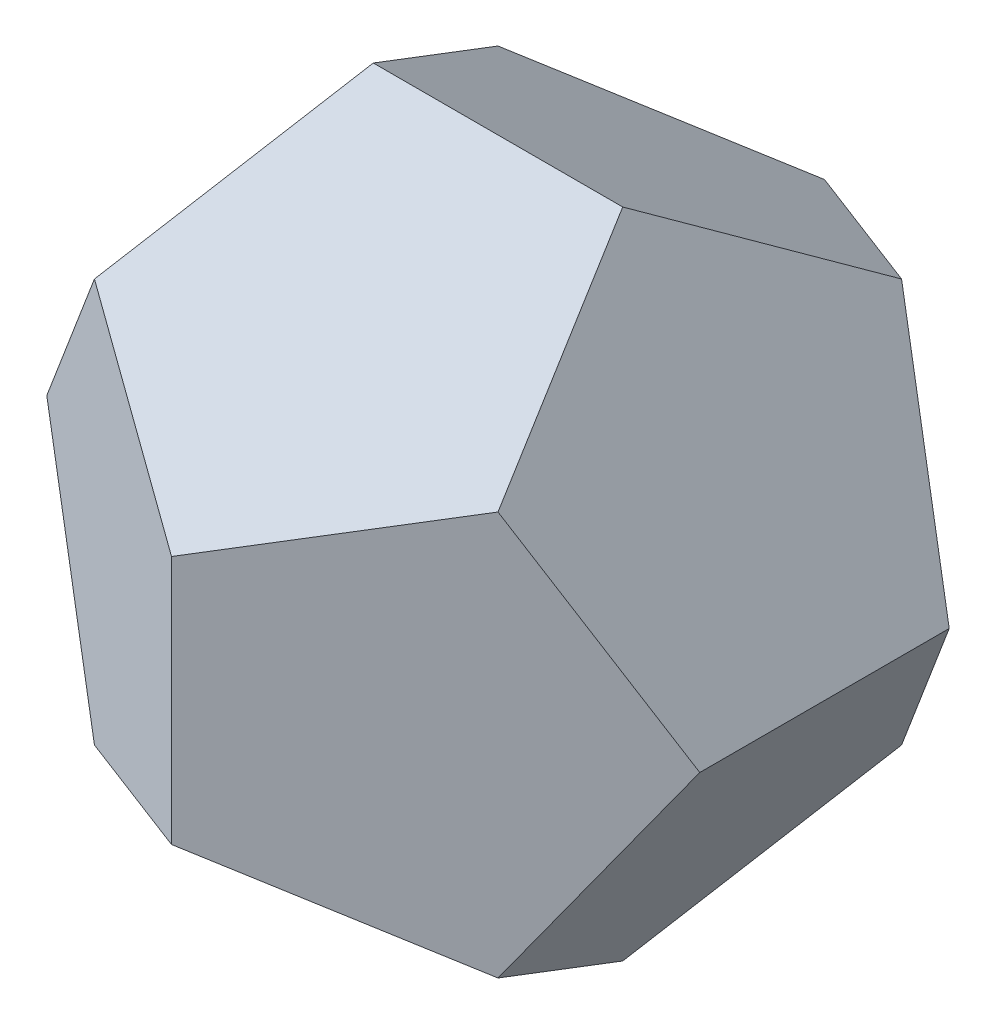
ISO-10303-21;
HEADER;
FILE_DESCRIPTION(('STEP AP214'),'2;1');
FILE_NAME('part.step','',(''),(''),'','','');
FILE_SCHEMA(('AUTOMOTIVE_DESIGN { 1 0 10303 214 1 1 1 1 }'));
ENDSEC;
DATA;
#1=APPLICATION_CONTEXT('core data for automotive mechanical design processes');
#2=APPLICATION_PROTOCOL_DEFINITION('international standard','automotive_design',2000,#1);
#3=PRODUCT_CONTEXT('',#1,'mechanical');
#4=PRODUCT('Part','Part','',(#3));
#5=PRODUCT_RELATED_PRODUCT_CATEGORY('part','',(#4));
#6=PRODUCT_DEFINITION_FORMATION('','',#4);
#7=PRODUCT_DEFINITION_CONTEXT('part definition',#1,'design');
#8=PRODUCT_DEFINITION('design','',#6,#7);
#9=PRODUCT_DEFINITION_SHAPE('','',#8);
#10=(LENGTH_UNIT() NAMED_UNIT(*) SI_UNIT(.MILLI.,.METRE.));
#11=(NAMED_UNIT(*) PLANE_ANGLE_UNIT() SI_UNIT($,.RADIAN.));
#12=(NAMED_UNIT(*) SI_UNIT($,.STERADIAN.) SOLID_ANGLE_UNIT());
#13=UNCERTAINTY_MEASURE_WITH_UNIT(LENGTH_MEASURE(1.E-05),#10,'distance_accuracy_value','');
#14=(GEOMETRIC_REPRESENTATION_CONTEXT(3) GLOBAL_UNCERTAINTY_ASSIGNED_CONTEXT((#13)) GLOBAL_UNIT_ASSIGNED_CONTEXT((#10,
#11,#12)) REPRESENTATION_CONTEXT('',''));
#15=CARTESIAN_POINT('',(0.,0.,0.));
#16=DIRECTION('',(0.,0.,1.));
#17=DIRECTION('',(1.,0.,0.));
#18=AXIS2_PLACEMENT_3D('',#15,#16,#17);
#19=CARTESIAN_POINT('',(-72.5,189.807464184367,0.));
#20=DIRECTION('',(0.85065080835204,-0.525731112119134,0.));
#21=DIRECTION('',(0.525731112119134,0.85065080835204,0.));
#22=AXIS2_PLACEMENT_3D('',#19,#20,#21);
#23=PLANE('',#22);
#24=DIRECTION('',(0.30901699437495,0.499999999999998,0.809016994374947));
#25=VECTOR('',#24,1.);
#26=CARTESIAN_POINT('',(-117.307464184368,117.307464184368,-117.307464184367));
#27=LINE('',#26,#25);
#28=CARTESIAN_POINT('',(-117.307464184367,117.307464184368,-117.307464184367));
#29=VERTEX_POINT('',#28);
#30=CARTESIAN_POINT('',(-72.5000000000002,189.807464184367,1.71390679426509E-12));
#31=VERTEX_POINT('',#30);
#32=EDGE_CURVE('E219',#29,#31,#27,.T.);
#33=ORIENTED_EDGE('',*,*,#32,.F.);
#34=DIRECTION('',(0.499999999999999,0.809016994374948,-0.309016994374948));
#35=VECTOR('',#34,1.);
#36=CARTESIAN_POINT('',(-189.807464184368,2.08166817117217E-13,-72.4999999999999));
#37=LINE('',#36,#35);
#38=CARTESIAN_POINT('',(-189.807464184368,2.08166817117217E-13,-72.4999999999999));
#39=VERTEX_POINT('',#38);
#40=EDGE_CURVE('E238',#39,#29,#37,.T.);
#41=ORIENTED_EDGE('',*,*,#40,.F.);
#42=DIRECTION('',(0.,0.,-1.));
#43=VECTOR('',#42,1.);
#44=CARTESIAN_POINT('',(-189.807464184367,0.,72.5));
#45=LINE('',#44,#43);
#46=CARTESIAN_POINT('',(-189.807464184367,0.,72.5));
#47=VERTEX_POINT('',#46);
#48=EDGE_CURVE('E218',#47,#39,#45,.T.);
#49=ORIENTED_EDGE('',*,*,#48,.F.);
#50=DIRECTION('',(-0.500000000000001,-0.809016994374947,-0.309016994374947));
#51=VECTOR('',#50,1.);
#52=CARTESIAN_POINT('',(-117.307464184367,117.307464184367,117.307464184367));
#53=LINE('',#52,#51);
#54=CARTESIAN_POINT('',(-117.307464184368,117.307464184366,117.307464184368));
#55=VERTEX_POINT('',#54);
#56=EDGE_CURVE('E204',#55,#47,#53,.T.);
#57=ORIENTED_EDGE('',*,*,#56,.F.);
#58=DIRECTION('',(-0.309016994374951,-0.500000000000007,0.809016994374942));
#59=VECTOR('',#58,1.);
#60=CARTESIAN_POINT('',(-72.5000000000002,189.807464184367,1.71390679426509E-12));
#61=LINE('',#60,#59);
#62=EDGE_CURVE('E604',#31,#55,#61,.T.);
#63=ORIENTED_EDGE('',*,*,#62,.F.);
#64=EDGE_LOOP('',(#33,#41,#49,#57,#63));
#65=FACE_BOUND('',#64,.T.);
#66=ADVANCED_FACE('F45',(#65),#23,.F.);
#67=CARTESIAN_POINT('',(-117.307464184367,-117.307464184369,-117.307464184366));
#68=DIRECTION('',(0.,0.850650808352043,0.525731112119128));
#69=DIRECTION('',(-0.951056516295156,0.162459848116443,-0.262865556059566));
#70=AXIS2_PLACEMENT_3D('',#67,#68,#69);
#71=PLANE('',#70);
#72=DIRECTION('',(-0.309016994374953,0.499999999999993,-0.80901699437495));
#73=VECTOR('',#72,1.);
#74=CARTESIAN_POINT('',(-72.4999999999985,-189.807464184368,1.65145674912992E-12));
#75=LINE('',#74,#73);
#76=CARTESIAN_POINT('',(-72.4999999999984,-189.807464184368,2.34534613952064E-12));
#77=VERTEX_POINT('',#76);
#78=CARTESIAN_POINT('',(-117.307464184368,-117.307464184367,-117.307464184368));
#79=VERTEX_POINT('',#78);
#80=EDGE_CURVE('E436',#77,#79,#75,.T.);
#81=ORIENTED_EDGE('',*,*,#80,.T.);
#82=DIRECTION('',(0.809016994374944,0.309016994374951,-0.500000000000003));
#83=VECTOR('',#82,1.);
#84=CARTESIAN_POINT('',(-117.307464184367,-117.307464184369,-117.307464184366));
#85=LINE('',#84,#83);
#86=CARTESIAN_POINT('',(6.17287096594779E-13,-72.5000000000013,-189.807464184367));
#87=VERTEX_POINT('',#86);
#88=EDGE_CURVE('E441',#79,#87,#85,.T.);
#89=ORIENTED_EDGE('',*,*,#88,.T.);
#90=DIRECTION('',(-0.809016994374949,0.309016994374938,-0.500000000000003));
#91=VECTOR('',#90,1.);
#92=CARTESIAN_POINT('',(117.307464184368,-117.307464184367,-117.307464184367));
#93=LINE('',#92,#91);
#94=CARTESIAN_POINT('',(117.307464184368,-117.307464184367,-117.307464184367));
#95=VERTEX_POINT('',#94);
#96=EDGE_CURVE('E311',#95,#87,#93,.T.);
#97=ORIENTED_EDGE('',*,*,#96,.F.);
#98=DIRECTION('',(-0.309016994374946,-0.500000000000001,0.809016994374947));
#99=VECTOR('',#98,1.);
#100=CARTESIAN_POINT('',(117.307464184369,-117.307464184367,-117.307464184367));
#101=LINE('',#100,#99);
#102=CARTESIAN_POINT('',(72.5000000000015,-189.807464184367,1.40859546249317E-12));
#103=VERTEX_POINT('',#102);
#104=EDGE_CURVE('E298',#95,#103,#101,.T.);
#105=ORIENTED_EDGE('',*,*,#104,.T.);
#106=DIRECTION('',(1.,0.,0.));
#107=VECTOR('',#106,1.);
#108=CARTESIAN_POINT('',(-72.4999999999984,-189.807464184368,2.34534613952064E-12));
#109=LINE('',#108,#107);
#110=EDGE_CURVE('E453',#77,#103,#109,.T.);
#111=ORIENTED_EDGE('',*,*,#110,.F.);
#112=EDGE_LOOP('',(#81,#89,#97,#105,#111));
#113=FACE_BOUND('',#112,.T.);
#114=ADVANCED_FACE('F260',(#113),#71,.F.);
#115=CARTESIAN_POINT('',(-72.5000000000002,-189.807464184367,-7.59513476607906E-13));
#116=DIRECTION('',(0.85065080835204,0.525731112119133,0.));
#117=DIRECTION('',(0.525731112119133,-0.85065080835204,0.));
#118=AXIS2_PLACEMENT_3D('',#115,#116,#117);
#119=PLANE('',#118);
#120=ORIENTED_EDGE('',*,*,#80,.F.);
#121=DIRECTION('',(0.309016994374948,-0.500000000000005,-0.809016994374945));
#122=VECTOR('',#121,1.);
#123=CARTESIAN_POINT('',(-117.307464184366,-117.307464184367,117.307464184369));
#124=LINE('',#123,#122);
#125=CARTESIAN_POINT('',(-117.307464184366,-117.307464184367,117.307464184369));
#126=VERTEX_POINT('',#125);
#127=EDGE_CURVE('E229',#126,#77,#124,.T.);
#128=ORIENTED_EDGE('',*,*,#127,.F.);
#129=DIRECTION('',(-0.5,0.809016994374948,-0.309016994374944));
#130=VECTOR('',#129,1.);
#131=CARTESIAN_POINT('',(-117.307464184367,-117.307464184368,117.307464184367));
#132=LINE('',#131,#130);
#133=EDGE_CURVE('E209',#126,#47,#132,.T.);
#134=ORIENTED_EDGE('',*,*,#133,.T.);
#135=ORIENTED_EDGE('',*,*,#48,.T.);
#136=DIRECTION('',(0.499999999999998,-0.809016994374947,-0.309016994374951));
#137=VECTOR('',#136,1.);
#138=CARTESIAN_POINT('',(-189.807464184368,2.08166817117217E-13,-72.4999999999999));
#139=LINE('',#138,#137);
#140=EDGE_CURVE('E231',#39,#79,#139,.T.);
#141=ORIENTED_EDGE('',*,*,#140,.T.);
#142=EDGE_LOOP('',(#120,#128,#134,#135,#141));
#143=FACE_BOUND('',#142,.T.);
#144=ADVANCED_FACE('F226',(#143),#119,.F.);
#145=CARTESIAN_POINT('',(-1.27487405190798E-12,-72.5000000000025,189.807464184366));
#146=DIRECTION('',(0.525731112119137,0.,-0.850650808352037));
#147=DIRECTION('',(0.688190960235584,-0.587785252292479,0.425325404176017));
#148=AXIS2_PLACEMENT_3D('',#145,#146,#147);
#149=PLANE('',#148);
#150=DIRECTION('',(-0.809016994374947,-0.309016994374957,-0.499999999999994));
#151=VECTOR('',#150,1.);
#152=CARTESIAN_POINT('',(1.5262821980066E-12,-72.4999999999982,189.807464184368));
#153=LINE('',#152,#151);
#154=CARTESIAN_POINT('',(1.5262821980066E-12,-72.4999999999982,189.807464184368));
#155=VERTEX_POINT('',#154);
#156=EDGE_CURVE('E384',#155,#126,#153,.T.);
#157=ORIENTED_EDGE('',*,*,#156,.F.);
#158=DIRECTION('',(0.,1.,0.));
#159=VECTOR('',#158,1.);
#160=CARTESIAN_POINT('',(-1.27660877538396E-12,-72.5000000000025,189.807464184366));
#161=LINE('',#160,#159);
#162=CARTESIAN_POINT('',(-1.02001740387436E-12,72.4999999999982,189.807464184368));
#163=VERTEX_POINT('',#162);
#164=EDGE_CURVE('E232',#155,#163,#161,.T.);
#165=ORIENTED_EDGE('',*,*,#164,.T.);
#166=DIRECTION('',(0.809016994374945,-0.309016994374951,0.500000000000001));
#167=VECTOR('',#166,1.);
#168=CARTESIAN_POINT('',(-117.307464184368,117.307464184366,117.307464184368));
#169=LINE('',#168,#167);
#170=EDGE_CURVE('E146',#55,#163,#169,.T.);
#171=ORIENTED_EDGE('',*,*,#170,.F.);
#172=ORIENTED_EDGE('',*,*,#56,.T.);
#173=ORIENTED_EDGE('',*,*,#133,.F.);
#174=EDGE_LOOP('',(#157,#165,#171,#172,#173));
#175=FACE_BOUND('',#174,.T.);
#176=ADVANCED_FACE('F208',(#175),#149,.F.);
#177=CARTESIAN_POINT('',(7.68609257775712E-13,72.5000000000025,189.807464184366));
#178=DIRECTION('',(-0.525731112119137,0.,-0.850650808352037));
#179=DIRECTION('',(-0.688190960235588,0.587785252292474,0.425325404176017));
#180=AXIS2_PLACEMENT_3D('',#177,#178,#179);
#181=PLANE('',#180);
#182=DIRECTION('',(0.809016994374949,0.309016994374952,-0.499999999999994));
#183=VECTOR('',#182,1.);
#184=CARTESIAN_POINT('',(-1.02001740387436E-12,72.4999999999982,189.807464184368));
#185=LINE('',#184,#183);
#186=CARTESIAN_POINT('',(117.307464184367,117.307464184366,117.307464184369));
#187=VERTEX_POINT('',#186);
#188=EDGE_CURVE('E630',#163,#187,#185,.T.);
#189=ORIENTED_EDGE('',*,*,#188,.F.);
#190=ORIENTED_EDGE('',*,*,#164,.F.);
#191=DIRECTION('',(-0.809016994374947,0.309016994374946,0.500000000000001));
#192=VECTOR('',#191,1.);
#193=CARTESIAN_POINT('',(117.307464184369,-117.307464184365,117.307464184368));
#194=LINE('',#193,#192);
#195=CARTESIAN_POINT('',(117.307464184369,-117.307464184365,117.307464184368));
#196=VERTEX_POINT('',#195);
#197=EDGE_CURVE('E375',#196,#155,#194,.T.);
#198=ORIENTED_EDGE('',*,*,#197,.F.);
#199=DIRECTION('',(0.499999999999995,0.80901699437495,-0.309016994374947));
#200=VECTOR('',#199,1.);
#201=CARTESIAN_POINT('',(117.307464184368,-117.307464184366,117.307464184367));
#202=LINE('',#201,#200);
#203=CARTESIAN_POINT('',(189.807464184367,1.4086851651926E-12,72.5));
#204=VERTEX_POINT('',#203);
#205=EDGE_CURVE('E302',#196,#204,#202,.T.);
#206=ORIENTED_EDGE('',*,*,#205,.T.);
#207=DIRECTION('',(0.500000000000006,-0.809016994374945,-0.309016994374944));
#208=VECTOR('',#207,1.);
#209=CARTESIAN_POINT('',(117.307464184366,117.307464184368,117.307464184367));
#210=LINE('',#209,#208);
#211=EDGE_CURVE('E600',#187,#204,#210,.T.);
#212=ORIENTED_EDGE('',*,*,#211,.F.);
#213=EDGE_LOOP('',(#189,#190,#198,#206,#212));
#214=FACE_BOUND('',#213,.T.);
#215=ADVANCED_FACE('F405',(#214),#181,.F.);
#216=CARTESIAN_POINT('',(117.307464184367,117.307464184369,-117.307464184366));
#217=DIRECTION('',(0.,-0.850650808352043,0.525731112119128));
#218=DIRECTION('',(0.951056516295155,-0.16245984811645,-0.262865556059566));
#219=AXIS2_PLACEMENT_3D('',#216,#217,#218);
#220=PLANE('',#219);
#221=DIRECTION('',(-0.309016994374953,0.5,0.809016994374945));
#222=VECTOR('',#221,1.);
#223=CARTESIAN_POINT('',(117.307464184367,117.307464184368,-117.307464184368));
#224=LINE('',#223,#222);
#225=CARTESIAN_POINT('',(117.307464184366,117.307464184367,-117.307464184368));
#226=VERTEX_POINT('',#225);
#227=CARTESIAN_POINT('',(72.4999999999988,189.807464184368,-7.6298292355986E-13));
#228=VERTEX_POINT('',#227);
#229=EDGE_CURVE('E378',#226,#228,#224,.T.);
#230=ORIENTED_EDGE('',*,*,#229,.F.);
#231=DIRECTION('',(0.809016994374944,0.309016994374956,0.5));
#232=VECTOR('',#231,1.);
#233=CARTESIAN_POINT('',(-5.89383818044165E-13,72.4999999999987,-189.807464184368));
#234=LINE('',#233,#232);
#235=CARTESIAN_POINT('',(-5.89383818044165E-13,72.4999999999987,-189.807464184368));
#236=VERTEX_POINT('',#235);
#237=EDGE_CURVE('E312',#236,#226,#234,.T.);
#238=ORIENTED_EDGE('',*,*,#237,.F.);
#239=DIRECTION('',(-0.809016994374949,0.309016994374943,0.500000000000001));
#240=VECTOR('',#239,1.);
#241=CARTESIAN_POINT('',(3.40005801291454E-13,72.5000000000014,-189.807464184366));
#242=LINE('',#241,#240);
#243=EDGE_CURVE('E137',#236,#29,#242,.T.);
#244=ORIENTED_EDGE('',*,*,#243,.T.);
#245=ORIENTED_EDGE('',*,*,#32,.T.);
#246=DIRECTION('',(-1.,0.,0.));
#247=VECTOR('',#246,1.);
#248=CARTESIAN_POINT('',(72.4999999999997,189.807464184367,2.34534613952064E-12));
#249=LINE('',#248,#247);
#250=EDGE_CURVE('E601',#228,#31,#249,.T.);
#251=ORIENTED_EDGE('',*,*,#250,.F.);
#252=EDGE_LOOP('',(#230,#238,#244,#245,#251));
#253=FACE_BOUND('',#252,.T.);
#254=ADVANCED_FACE('F723',(#253),#220,.F.);
#255=CARTESIAN_POINT('',(117.307464184367,117.307464184366,117.307464184369));
#256=DIRECTION('',(0.,-0.850650808352035,-0.52573111211914));
#257=DIRECTION('',(0.951056516295153,-0.162459848116455,0.26286555605957));
#258=AXIS2_PLACEMENT_3D('',#255,#256,#257);
#259=PLANE('',#258);
#260=ORIENTED_EDGE('',*,*,#188,.T.);
#261=DIRECTION('',(-0.309016994374944,0.500000000000007,-0.809016994374945));
#262=VECTOR('',#261,1.);
#263=CARTESIAN_POINT('',(117.307464184367,117.307464184366,117.307464184369));
#264=LINE('',#263,#262);
#265=EDGE_CURVE('E605',#187,#228,#264,.T.);
#266=ORIENTED_EDGE('',*,*,#265,.T.);
#267=ORIENTED_EDGE('',*,*,#250,.T.);
#268=ORIENTED_EDGE('',*,*,#62,.T.);
#269=ORIENTED_EDGE('',*,*,#170,.T.);
#270=EDGE_LOOP('',(#260,#266,#267,#268,#269));
#271=FACE_BOUND('',#270,.T.);
#272=ADVANCED_FACE('F516',(#271),#259,.F.);
#273=CARTESIAN_POINT('',(72.4999999999988,189.807464184368,-7.59513476607906E-13));
#274=DIRECTION('',(-0.850650808352037,-0.525731112119139,0.));
#275=DIRECTION('',(-0.525731112119139,0.850650808352037,0.));
#276=AXIS2_PLACEMENT_3D('',#273,#274,#275);
#277=PLANE('',#276);
#278=ORIENTED_EDGE('',*,*,#229,.T.);
#279=ORIENTED_EDGE('',*,*,#265,.F.);
#280=ORIENTED_EDGE('',*,*,#211,.T.);
#281=DIRECTION('',(0.,0.,-1.));
#282=VECTOR('',#281,1.);
#283=CARTESIAN_POINT('',(189.807464184367,1.4086851651926E-12,72.5));
#284=LINE('',#283,#282);
#285=CARTESIAN_POINT('',(189.807464184368,1.11725162122849E-12,-72.4999999999999));
#286=VERTEX_POINT('',#285);
#287=EDGE_CURVE('E634',#204,#286,#284,.T.);
#288=ORIENTED_EDGE('',*,*,#287,.T.);
#289=DIRECTION('',(-0.500000000000004,0.809016994374944,-0.309016994374951));
#290=VECTOR('',#289,1.);
#291=CARTESIAN_POINT('',(189.807464184368,1.11725162122849E-12,-72.4999999999999));
#292=LINE('',#291,#290);
#293=EDGE_CURVE('E313',#286,#226,#292,.T.);
#294=ORIENTED_EDGE('',*,*,#293,.T.);
#295=EDGE_LOOP('',(#278,#279,#280,#288,#294));
#296=FACE_BOUND('',#295,.T.);
#297=ADVANCED_FACE('F718',(#296),#277,.F.);
#298=CARTESIAN_POINT('',(-117.307464184366,-117.307464184367,117.307464184369));
#299=DIRECTION('',(0.,0.850650808352035,-0.52573111211914));
#300=DIRECTION('',(-0.951056516295154,0.162459848116449,0.26286555605957));
#301=AXIS2_PLACEMENT_3D('',#298,#299,#300);
#302=PLANE('',#301);
#303=ORIENTED_EDGE('',*,*,#156,.T.);
#304=ORIENTED_EDGE('',*,*,#127,.T.);
#305=ORIENTED_EDGE('',*,*,#110,.T.);
#306=DIRECTION('',(0.309016994374947,0.500000000000009,0.809016994374942));
#307=VECTOR('',#306,1.);
#308=CARTESIAN_POINT('',(72.5000000000015,-189.807464184367,1.71390679426509E-12));
#309=LINE('',#308,#307);
#310=EDGE_CURVE('E379',#103,#196,#309,.T.);
#311=ORIENTED_EDGE('',*,*,#310,.T.);
#312=ORIENTED_EDGE('',*,*,#197,.T.);
#313=EDGE_LOOP('',(#303,#304,#305,#311,#312));
#314=FACE_BOUND('',#313,.T.);
#315=ADVANCED_FACE('F339',(#314),#302,.F.);
#316=CARTESIAN_POINT('',(-5.87649094568189E-13,72.4999999999987,-189.807464184368));
#317=DIRECTION('',(-0.525731112119135,0.,0.850650808352039));
#318=DIRECTION('',(-0.688190960235591,0.587785252292466,-0.425325404176024));
#319=AXIS2_PLACEMENT_3D('',#316,#317,#318);
#320=PLANE('',#319);
#321=DIRECTION('',(0.,1.,0.));
#322=VECTOR('',#321,1.);
#323=CARTESIAN_POINT('',(6.17287096594779E-13,-72.5000000000013,-189.807464184367));
#324=LINE('',#323,#322);
#325=EDGE_CURVE('E361',#87,#236,#324,.T.);
#326=ORIENTED_EDGE('',*,*,#325,.T.);
#327=ORIENTED_EDGE('',*,*,#237,.T.);
#328=ORIENTED_EDGE('',*,*,#293,.F.);
#329=DIRECTION('',(-0.499999999999993,-0.809016994374953,-0.309016994374944));
#330=VECTOR('',#329,1.);
#331=CARTESIAN_POINT('',(189.807464184367,7.84184713840945E-13,-72.4999999999999));
#332=LINE('',#331,#330);
#333=EDGE_CURVE('E307',#286,#95,#332,.T.);
#334=ORIENTED_EDGE('',*,*,#333,.T.);
#335=ORIENTED_EDGE('',*,*,#96,.T.);
#336=EDGE_LOOP('',(#326,#327,#328,#334,#335));
#337=FACE_BOUND('',#336,.T.);
#338=ADVANCED_FACE('F330',(#337),#320,.F.);
#339=CARTESIAN_POINT('',(72.5000000000014,-189.807464184367,0.));
#340=DIRECTION('',(-0.850650808352044,0.525731112119128,0.));
#341=DIRECTION('',(-0.525731112119128,-0.850650808352044,0.));
#342=AXIS2_PLACEMENT_3D('',#339,#340,#341);
#343=PLANE('',#342);
#344=ORIENTED_EDGE('',*,*,#104,.F.);
#345=ORIENTED_EDGE('',*,*,#333,.F.);
#346=ORIENTED_EDGE('',*,*,#287,.F.);
#347=ORIENTED_EDGE('',*,*,#205,.F.);
#348=ORIENTED_EDGE('',*,*,#310,.F.);
#349=EDGE_LOOP('',(#344,#345,#346,#347,#348));
#350=FACE_BOUND('',#349,.T.);
#351=ADVANCED_FACE('F263',(#350),#343,.F.);
#352=CARTESIAN_POINT('',(0.,-72.4999999999987,-189.807464184368));
#353=DIRECTION('',(0.525731112119135,0.,0.850650808352039));
#354=DIRECTION('',(0.688190960235587,-0.58778525229247,-0.425325404176024));
#355=AXIS2_PLACEMENT_3D('',#352,#353,#354);
#356=PLANE('',#355);
#357=ORIENTED_EDGE('',*,*,#325,.F.);
#358=ORIENTED_EDGE('',*,*,#88,.F.);
#359=ORIENTED_EDGE('',*,*,#140,.F.);
#360=ORIENTED_EDGE('',*,*,#40,.T.);
#361=ORIENTED_EDGE('',*,*,#243,.F.);
#362=EDGE_LOOP('',(#357,#358,#359,#360,#361));
#363=FACE_BOUND('',#362,.T.);
#364=ADVANCED_FACE('F497',(#363),#356,.F.);
#365=CLOSED_SHELL('',(#66,#114,#144,#176,#215,#254,#272,#297,#315,#338,#351,#364));
#366=CARTESIAN_POINT('',(-68.2467459582398,187.178808623772,0.));
#367=DIRECTION('',(0.85065080835204,-0.525731112119134,0.));
#368=DIRECTION('',(0.525731112119134,0.85065080835204,0.));
#369=AXIS2_PLACEMENT_3D('',#366,#367,#368);
#370=PLANE('',#369);
#371=DIRECTION('',(0.309016994374948,0.499999999999995,0.80901699437495));
#372=VECTOR('',#371,1.);
#373=CARTESIAN_POINT('',(-91.9648058307211,148.802181602892,-56.8373757721686));
#374=LINE('',#373,#372);
#375=CARTESIAN_POINT('',(-113.674751544341,113.674751544341,-113.67475154434));
#376=VERTEX_POINT('',#375);
#377=CARTESIAN_POINT('',(-70.2548601171021,183.929611661443,1.19349787717184E-12));
#378=VERTEX_POINT('',#377);
#379=EDGE_CURVE('E671',#376,#378,#374,.T.);
#380=ORIENTED_EDGE('',*,*,#379,.T.);
#381=DIRECTION('',(-0.309016994374949,-0.500000000000007,0.809016994374943));
#382=VECTOR('',#381,1.);
#383=CARTESIAN_POINT('',(-91.9648058307218,148.802181602891,56.837375772172));
#384=LINE('',#383,#382);
#385=CARTESIAN_POINT('',(-113.674751544341,113.674751544339,113.674751544341));
#386=VERTEX_POINT('',#385);
#387=EDGE_CURVE('E682',#378,#386,#384,.T.);
#388=ORIENTED_EDGE('',*,*,#387,.T.);
#389=DIRECTION('',(-0.499999999999999,-0.809016994374944,-0.309016994374958));
#390=VECTOR('',#389,1.);
#391=CARTESIAN_POINT('',(-148.802181602892,56.8373757721688,91.9648058307211));
#392=LINE('',#391,#390);
#393=CARTESIAN_POINT('',(-183.929611661442,0.,70.2548601171016));
#394=VERTEX_POINT('',#393);
#395=EDGE_CURVE('E666',#386,#394,#392,.T.);
#396=ORIENTED_EDGE('',*,*,#395,.T.);
#397=DIRECTION('',(0.,0.,-1.));
#398=VECTOR('',#397,1.);
#399=CARTESIAN_POINT('',(-183.929611661443,0.,0.));
#400=LINE('',#399,#398);
#401=CARTESIAN_POINT('',(-183.929611661443,1.88786857444522E-13,-70.2548601171018));
#402=VERTEX_POINT('',#401);
#403=EDGE_CURVE('E130',#394,#402,#400,.T.);
#404=ORIENTED_EDGE('',*,*,#403,.T.);
#405=DIRECTION('',(0.5,0.809016994374949,-0.309016994374945));
#406=VECTOR('',#405,1.);
#407=CARTESIAN_POINT('',(-148.802181602891,56.8373757721712,-91.9648058307211));
#408=LINE('',#407,#406);
#409=EDGE_CURVE('E12',#402,#376,#408,.T.);
#410=ORIENTED_EDGE('',*,*,#409,.T.);
#411=EDGE_LOOP('',(#380,#388,#396,#404,#410));
#412=FACE_BOUND('',#411,.T.);
#413=ADVANCED_FACE('F518',(#412),#370,.T.);
#414=CARTESIAN_POINT('',(-117.307464184367,-113.054210142609,-114.67880862377));
#415=DIRECTION('',(0.,0.850650808352043,0.525731112119128));
#416=DIRECTION('',(-0.951056516295156,0.162459848116443,-0.262865556059566));
#417=AXIS2_PLACEMENT_3D('',#414,#415,#416);
#418=PLANE('',#417);
#419=DIRECTION('',(-0.309016994374945,0.499999999999994,-0.809016994374952));
#420=VECTOR('',#419,1.);
#421=CARTESIAN_POINT('',(-114.368537922904,-112.552181602894,-115.491107864353));
#422=LINE('',#421,#420);
#423=CARTESIAN_POINT('',(-70.2548601171017,-183.929611661443,1.414549852326E-12));
#424=VERTEX_POINT('',#423);
#425=CARTESIAN_POINT('',(-113.67475154434,-113.674751544341,-113.674751544341));
#426=VERTEX_POINT('',#425);
#427=EDGE_CURVE('E49',#424,#426,#422,.T.);
#428=ORIENTED_EDGE('',*,*,#427,.F.);
#429=DIRECTION('',(1.,0.,0.));
#430=VECTOR('',#429,1.);
#431=CARTESIAN_POINT('',(-117.307464184365,-183.929611661444,1.49880108324396E-12));
#432=LINE('',#431,#430);
#433=CARTESIAN_POINT('',(70.2548601171034,-183.929611661442,1.19289520533427E-12));
#434=VERTEX_POINT('',#433);
#435=EDGE_CURVE('E700',#424,#434,#432,.T.);
#436=ORIENTED_EDGE('',*,*,#435,.T.);
#437=DIRECTION('',(-0.309016994374944,-0.499999999999998,0.80901699437495));
#438=VECTOR('',#437,1.);
#439=CARTESIAN_POINT('',(91.9648058307222,-148.802181602892,-56.8373757721686));
#440=LINE('',#439,#438);
#441=CARTESIAN_POINT('',(113.674751544342,-113.67475154434,-113.67475154434));
#442=VERTEX_POINT('',#441);
#443=EDGE_CURVE('E653',#442,#434,#440,.T.);
#444=ORIENTED_EDGE('',*,*,#443,.F.);
#445=DIRECTION('',(-0.809016994374949,0.309016994374938,-0.500000000000002));
#446=VECTOR('',#445,1.);
#447=CARTESIAN_POINT('',(-38.0663563200128,-55.7148058307226,-207.455913695075));
#448=LINE('',#447,#446);
#449=CARTESIAN_POINT('',(-1.74648934780069E-13,-70.2548601171026,-183.929611661443));
#450=VERTEX_POINT('',#449);
#451=EDGE_CURVE('E56',#442,#450,#448,.T.);
#452=ORIENTED_EDGE('',*,*,#451,.T.);
#453=DIRECTION('',(0.809016994374947,0.30901699437495,-0.5));
#454=VECTOR('',#453,1.);
#455=CARTESIAN_POINT('',(-115.491107864355,-114.368537922906,-112.552181602892));
#456=LINE('',#455,#454);
#457=EDGE_CURVE('E649',#426,#450,#456,.T.);
#458=ORIENTED_EDGE('',*,*,#457,.F.);
#459=EDGE_LOOP('',(#428,#436,#444,#452,#458));
#460=FACE_BOUND('',#459,.T.);
#461=ADVANCED_FACE('F928',(#460),#418,.T.);
#462=CARTESIAN_POINT('',(-68.24674595824,-187.178808623772,-7.66165402076415E-13));
#463=DIRECTION('',(0.85065080835204,0.525731112119133,0.));
#464=DIRECTION('',(0.525731112119133,-0.85065080835204,0.));
#465=AXIS2_PLACEMENT_3D('',#462,#463,#464);
#466=PLANE('',#465);
#467=ORIENTED_EDGE('',*,*,#427,.T.);
#468=DIRECTION('',(0.499999999999999,-0.809016994374947,-0.30901699437495));
#469=VECTOR('',#468,1.);
#470=CARTESIAN_POINT('',(-90.1484495107084,-151.741107864354,-128.214805830722));
#471=LINE('',#470,#469);
#472=EDGE_CURVE('E125',#402,#426,#471,.T.);
#473=ORIENTED_EDGE('',*,*,#472,.F.);
#474=ORIENTED_EDGE('',*,*,#403,.F.);
#475=DIRECTION('',(-0.500000000000001,0.809016994374949,-0.309016994374943));
#476=VECTOR('',#475,1.);
#477=CARTESIAN_POINT('',(-90.1484495107075,-151.741107864355,128.21480583072));
#478=LINE('',#477,#476);
#479=CARTESIAN_POINT('',(-113.67475154434,-113.674751544342,113.67475154434));
#480=VERTEX_POINT('',#479);
#481=EDGE_CURVE('E656',#480,#394,#478,.T.);
#482=ORIENTED_EDGE('',*,*,#481,.F.);
#483=DIRECTION('',(0.309016994374948,-0.500000000000004,-0.809016994374945));
#484=VECTOR('',#483,1.);
#485=CARTESIAN_POINT('',(-114.368537922905,-112.552181602891,115.491107864355));
#486=LINE('',#485,#484);
#487=EDGE_CURVE('E698',#480,#424,#486,.T.);
#488=ORIENTED_EDGE('',*,*,#487,.T.);
#489=EDGE_LOOP('',(#467,#473,#474,#482,#488));
#490=FACE_BOUND('',#489,.T.);
#491=ADVANCED_FACE('F935',(#490),#466,.T.);
#492=CARTESIAN_POINT('',(2.62865556059441,-72.5000000000024,185.554210142606));
#493=DIRECTION('',(0.525731112119137,0.,-0.850650808352037));
#494=DIRECTION('',(0.688190960235584,-0.587785252292479,0.425325404176017));
#495=AXIS2_PLACEMENT_3D('',#492,#493,#494);
#496=PLANE('',#495);
#497=DIRECTION('',(-0.809016994374939,-0.309016994374963,-0.500000000000003));
#498=VECTOR('',#497,1.);
#499=CARTESIAN_POINT('',(-115.491107864351,-114.368537922906,112.552181602892));
#500=LINE('',#499,#498);
#501=CARTESIAN_POINT('',(1.39171379421478E-12,-70.2548601171005,183.929611661443));
#502=VERTEX_POINT('',#501);
#503=EDGE_CURVE('E696',#502,#480,#500,.T.);
#504=ORIENTED_EDGE('',*,*,#503,.T.);
#505=ORIENTED_EDGE('',*,*,#481,.T.);
#506=ORIENTED_EDGE('',*,*,#395,.F.);
#507=DIRECTION('',(0.809016994374945,-0.309016994374951,0.500000000000001));
#508=VECTOR('',#507,1.);
#509=CARTESIAN_POINT('',(38.0663563200125,55.7148058307195,207.455913695076));
#510=LINE('',#509,#508);
#511=CARTESIAN_POINT('',(-1.39222662935288E-12,70.2548601171006,183.929611661443));
#512=VERTEX_POINT('',#511);
#513=EDGE_CURVE('E684',#386,#512,#510,.T.);
#514=ORIENTED_EDGE('',*,*,#513,.T.);
#515=DIRECTION('',(0.,1.,0.));
#516=VECTOR('',#515,1.);
#517=CARTESIAN_POINT('',(1.43678471897779E-12,-72.5000000000025,183.929611661443));
#518=LINE('',#517,#516);
#519=EDGE_CURVE('E663',#502,#512,#518,.T.);
#520=ORIENTED_EDGE('',*,*,#519,.F.);
#521=EDGE_LOOP('',(#504,#505,#506,#514,#520));
#522=FACE_BOUND('',#521,.T.);
#523=ADVANCED_FACE('F942',(#522),#496,.T.);
#524=CARTESIAN_POINT('',(-2.62865556059492,72.5000000000024,185.554210142606));
#525=DIRECTION('',(-0.525731112119137,0.,-0.850650808352037));
#526=DIRECTION('',(-0.688190960235588,0.587785252292474,0.425325404176017));
#527=AXIS2_PLACEMENT_3D('',#524,#525,#526);
#528=PLANE('',#527);
#529=DIRECTION('',(0.80901699437494,0.309016994374959,-0.500000000000005));
#530=VECTOR('',#529,1.);
#531=CARTESIAN_POINT('',(115.491107864351,114.368537922905,112.552181602891));
#532=LINE('',#531,#530);
#533=CARTESIAN_POINT('',(113.67475154434,113.674751544341,113.674751544339));
#534=VERTEX_POINT('',#533);
#535=EDGE_CURVE('E674',#512,#534,#532,.T.);
#536=ORIENTED_EDGE('',*,*,#535,.T.);
#537=DIRECTION('',(0.500000000000006,-0.809016994374945,-0.309016994374943));
#538=VECTOR('',#537,1.);
#539=CARTESIAN_POINT('',(90.1484495107064,151.741107864355,128.21480583072));
#540=LINE('',#539,#538);
#541=CARTESIAN_POINT('',(183.929611661442,1.36536525533598E-12,70.2548601171016));
#542=VERTEX_POINT('',#541);
#543=EDGE_CURVE('E688',#534,#542,#540,.T.);
#544=ORIENTED_EDGE('',*,*,#543,.T.);
#545=DIRECTION('',(0.499999999999993,0.809016994374948,-0.309016994374958));
#546=VECTOR('',#545,1.);
#547=CARTESIAN_POINT('',(148.802181602893,-56.8373757721677,91.9648058307211));
#548=LINE('',#547,#546);
#549=CARTESIAN_POINT('',(113.674751544342,-113.674751544339,113.674751544341));
#550=VERTEX_POINT('',#549);
#551=EDGE_CURVE('E65',#550,#542,#548,.T.);
#552=ORIENTED_EDGE('',*,*,#551,.F.);
#553=DIRECTION('',(-0.809016994374948,0.309016994374945,0.500000000000001));
#554=VECTOR('',#553,1.);
#555=CARTESIAN_POINT('',(-38.0663563200121,-55.7148058307198,207.455913695076));
#556=LINE('',#555,#554);
#557=EDGE_CURVE('E704',#550,#502,#556,.T.);
#558=ORIENTED_EDGE('',*,*,#557,.T.);
#559=ORIENTED_EDGE('',*,*,#519,.T.);
#560=EDGE_LOOP('',(#536,#544,#552,#558,#559));
#561=FACE_BOUND('',#560,.T.);
#562=ADVANCED_FACE('F949',(#561),#528,.T.);
#563=CARTESIAN_POINT('',(117.307464184367,113.054210142608,-114.67880862377));
#564=DIRECTION('',(0.,-0.850650808352043,0.525731112119128));
#565=DIRECTION('',(0.951056516295155,-0.16245984811645,-0.262865556059566));
#566=AXIS2_PLACEMENT_3D('',#563,#564,#565);
#567=PLANE('',#566);
#568=DIRECTION('',(-0.30901699437495,0.499999999999995,0.80901699437495));
#569=VECTOR('',#568,1.);
#570=CARTESIAN_POINT('',(69.5610737385371,185.052181602891,1.8163563200135));
#571=LINE('',#570,#569);
#572=CARTESIAN_POINT('',(113.67475154434,113.674751544341,-113.674751544341));
#573=VERTEX_POINT('',#572);
#574=CARTESIAN_POINT('',(70.2548601171011,183.929611661443,1.41489395655607E-12));
#575=VERTEX_POINT('',#574);
#576=EDGE_CURVE('E686',#573,#575,#571,.T.);
#577=ORIENTED_EDGE('',*,*,#576,.T.);
#578=DIRECTION('',(-1.,0.,0.));
#579=VECTOR('',#578,1.);
#580=CARTESIAN_POINT('',(117.307464184367,183.929611661443,1.49880108324396E-12));
#581=LINE('',#580,#579);
#582=EDGE_CURVE('E680',#575,#378,#581,.T.);
#583=ORIENTED_EDGE('',*,*,#582,.T.);
#584=ORIENTED_EDGE('',*,*,#379,.F.);
#585=DIRECTION('',(-0.809016994374947,0.309016994374944,0.500000000000002));
#586=VECTOR('',#585,1.);
#587=CARTESIAN_POINT('',(38.0663563200128,55.7148058307225,-207.455913695075));
#588=LINE('',#587,#586);
#589=CARTESIAN_POINT('',(1.74511960007107E-13,70.2548601171028,-183.929611661443));
#590=VERTEX_POINT('',#589);
#591=EDGE_CURVE('E669',#590,#376,#588,.T.);
#592=ORIENTED_EDGE('',*,*,#591,.F.);
#593=DIRECTION('',(0.809016994374948,0.309016994374945,0.500000000000002));
#594=VECTOR('',#593,1.);
#595=CARTESIAN_POINT('',(-1.81635632001445,69.5610737385379,-185.052181602892));
#596=LINE('',#595,#594);
#597=EDGE_CURVE('E708',#590,#573,#596,.T.);
#598=ORIENTED_EDGE('',*,*,#597,.T.);
#599=EDGE_LOOP('',(#577,#583,#584,#592,#598));
#600=FACE_BOUND('',#599,.T.);
#601=ADVANCED_FACE('F957',(#600),#567,.T.);
#602=CARTESIAN_POINT('',(117.307464184367,113.054210142606,114.678808623774));
#603=DIRECTION('',(0.,-0.850650808352035,-0.52573111211914));
#604=DIRECTION('',(0.951056516295153,-0.162459848116455,0.26286555605957));
#605=AXIS2_PLACEMENT_3D('',#602,#603,#604);
#606=PLANE('',#605);
#607=ORIENTED_EDGE('',*,*,#535,.F.);
#608=ORIENTED_EDGE('',*,*,#513,.F.);
#609=ORIENTED_EDGE('',*,*,#387,.F.);
#610=ORIENTED_EDGE('',*,*,#582,.F.);
#611=DIRECTION('',(-0.309016994374954,0.500000000000005,-0.809016994374942));
#612=VECTOR('',#611,1.);
#613=CARTESIAN_POINT('',(114.368537922905,112.552181602891,115.491107864356));
#614=LINE('',#613,#612);
#615=EDGE_CURVE('E677',#534,#575,#614,.T.);
#616=ORIENTED_EDGE('',*,*,#615,.F.);
#617=EDGE_LOOP('',(#607,#608,#609,#610,#616));
#618=FACE_BOUND('',#617,.T.);
#619=ADVANCED_FACE('F964',(#618),#606,.T.);
#620=CARTESIAN_POINT('',(68.2467459582386,187.178808623772,-7.66165402076415E-13));
#621=DIRECTION('',(-0.850650808352037,-0.525731112119139,0.));
#622=DIRECTION('',(-0.525731112119139,0.850650808352037,0.));
#623=AXIS2_PLACEMENT_3D('',#620,#621,#622);
#624=PLANE('',#623);
#625=ORIENTED_EDGE('',*,*,#576,.F.);
#626=DIRECTION('',(-0.500000000000004,0.809016994374944,-0.30901699437495));
#627=VECTOR('',#626,1.);
#628=CARTESIAN_POINT('',(90.1484495107073,151.741107864354,-128.214805830722));
#629=LINE('',#628,#627);
#630=CARTESIAN_POINT('',(183.929611661443,1.08669822835538E-12,-70.2548601171018));
#631=VERTEX_POINT('',#630);
#632=EDGE_CURVE('E693',#631,#573,#629,.T.);
#633=ORIENTED_EDGE('',*,*,#632,.F.);
#634=DIRECTION('',(0.,0.,-1.));
#635=VECTOR('',#634,1.);
#636=CARTESIAN_POINT('',(183.929611661443,1.22124532708767E-12,0.));
#637=LINE('',#636,#635);
#638=EDGE_CURVE('E690',#542,#631,#637,.T.);
#639=ORIENTED_EDGE('',*,*,#638,.F.);
#640=ORIENTED_EDGE('',*,*,#543,.F.);
#641=ORIENTED_EDGE('',*,*,#615,.T.);
#642=EDGE_LOOP('',(#625,#633,#639,#640,#641));
#643=FACE_BOUND('',#642,.T.);
#644=ADVANCED_FACE('F972',(#643),#624,.T.);
#645=CARTESIAN_POINT('',(-117.307464184366,-113.054210142607,114.678808623774));
#646=DIRECTION('',(0.,0.850650808352035,-0.52573111211914));
#647=DIRECTION('',(-0.951056516295154,0.162459848116449,0.26286555605957));
#648=AXIS2_PLACEMENT_3D('',#645,#646,#647);
#649=PLANE('',#648);
#650=ORIENTED_EDGE('',*,*,#503,.F.);
#651=ORIENTED_EDGE('',*,*,#557,.F.);
#652=DIRECTION('',(0.309016994374945,0.500000000000009,0.809016994374943));
#653=VECTOR('',#652,1.);
#654=CARTESIAN_POINT('',(91.9648058307228,-148.80218160289,56.837375772172));
#655=LINE('',#654,#653);
#656=EDGE_CURVE('E702',#434,#550,#655,.T.);
#657=ORIENTED_EDGE('',*,*,#656,.F.);
#658=ORIENTED_EDGE('',*,*,#435,.F.);
#659=ORIENTED_EDGE('',*,*,#487,.F.);
#660=EDGE_LOOP('',(#650,#651,#657,#658,#659));
#661=FACE_BOUND('',#660,.T.);
#662=ADVANCED_FACE('F980',(#661),#649,.T.);
#663=CARTESIAN_POINT('',(-2.62865556059626,72.4999999999987,-185.554210142608));
#664=DIRECTION('',(-0.525731112119135,0.,0.850650808352039));
#665=DIRECTION('',(-0.688190960235591,0.587785252292466,-0.425325404176024));
#666=AXIS2_PLACEMENT_3D('',#663,#664,#665);
#667=PLANE('',#666);
#668=DIRECTION('',(0.,1.,0.));
#669=VECTOR('',#668,1.);
#670=CARTESIAN_POINT('',(1.81278603239576E-13,72.4999999999986,-183.929611661443));
#671=LINE('',#670,#669);
#672=EDGE_CURVE('E706',#450,#590,#671,.T.);
#673=ORIENTED_EDGE('',*,*,#672,.F.);
#674=ORIENTED_EDGE('',*,*,#451,.F.);
#675=DIRECTION('',(-0.499999999999994,-0.809016994374952,-0.309016994374945));
#676=VECTOR('',#675,1.);
#677=CARTESIAN_POINT('',(148.802181602892,-56.8373757721702,-91.9648058307211));
#678=LINE('',#677,#676);
#679=EDGE_CURVE('E710',#631,#442,#678,.T.);
#680=ORIENTED_EDGE('',*,*,#679,.F.);
#681=ORIENTED_EDGE('',*,*,#632,.T.);
#682=ORIENTED_EDGE('',*,*,#597,.F.);
#683=EDGE_LOOP('',(#673,#674,#680,#681,#682));
#684=FACE_BOUND('',#683,.T.);
#685=ADVANCED_FACE('F988',(#684),#667,.T.);
#686=CARTESIAN_POINT('',(68.2467459582411,-187.178808623771,0.));
#687=DIRECTION('',(-0.850650808352044,0.525731112119128,0.));
#688=DIRECTION('',(-0.525731112119128,-0.850650808352044,0.));
#689=AXIS2_PLACEMENT_3D('',#686,#687,#688);
#690=PLANE('',#689);
#691=ORIENTED_EDGE('',*,*,#443,.T.);
#692=ORIENTED_EDGE('',*,*,#656,.T.);
#693=ORIENTED_EDGE('',*,*,#551,.T.);
#694=ORIENTED_EDGE('',*,*,#638,.T.);
#695=ORIENTED_EDGE('',*,*,#679,.T.);
#696=EDGE_LOOP('',(#691,#692,#693,#694,#695));
#697=FACE_BOUND('',#696,.T.);
#698=ADVANCED_FACE('F996',(#697),#690,.T.);
#699=CARTESIAN_POINT('',(2.62865556059575,-72.4999999999987,-185.554210142608));
#700=DIRECTION('',(0.525731112119135,0.,0.850650808352039));
#701=DIRECTION('',(0.688190960235587,-0.58778525229247,-0.425325404176024));
#702=AXIS2_PLACEMENT_3D('',#699,#700,#701);
#703=PLANE('',#702);
#704=ORIENTED_EDGE('',*,*,#672,.T.);
#705=ORIENTED_EDGE('',*,*,#591,.T.);
#706=ORIENTED_EDGE('',*,*,#409,.F.);
#707=ORIENTED_EDGE('',*,*,#472,.T.);
#708=ORIENTED_EDGE('',*,*,#457,.T.);
#709=EDGE_LOOP('',(#704,#705,#706,#707,#708));
#710=FACE_BOUND('',#709,.T.);
#711=ADVANCED_FACE('F47',(#710),#703,.T.);
#712=CLOSED_SHELL('',(#413,#461,#491,#523,#562,#601,#619,#644,#662,#685,#698,#711));
#713=ORIENTED_CLOSED_SHELL('',*,#712,.T.);
#714=BREP_WITH_VOIDS('B2',#365,(#713));
#715=ADVANCED_BREP_SHAPE_REPRESENTATION('',(#18,#714),#14);
#716=SHAPE_DEFINITION_REPRESENTATION(#9,#715);
ENDSEC;
END-ISO-10303-21;
